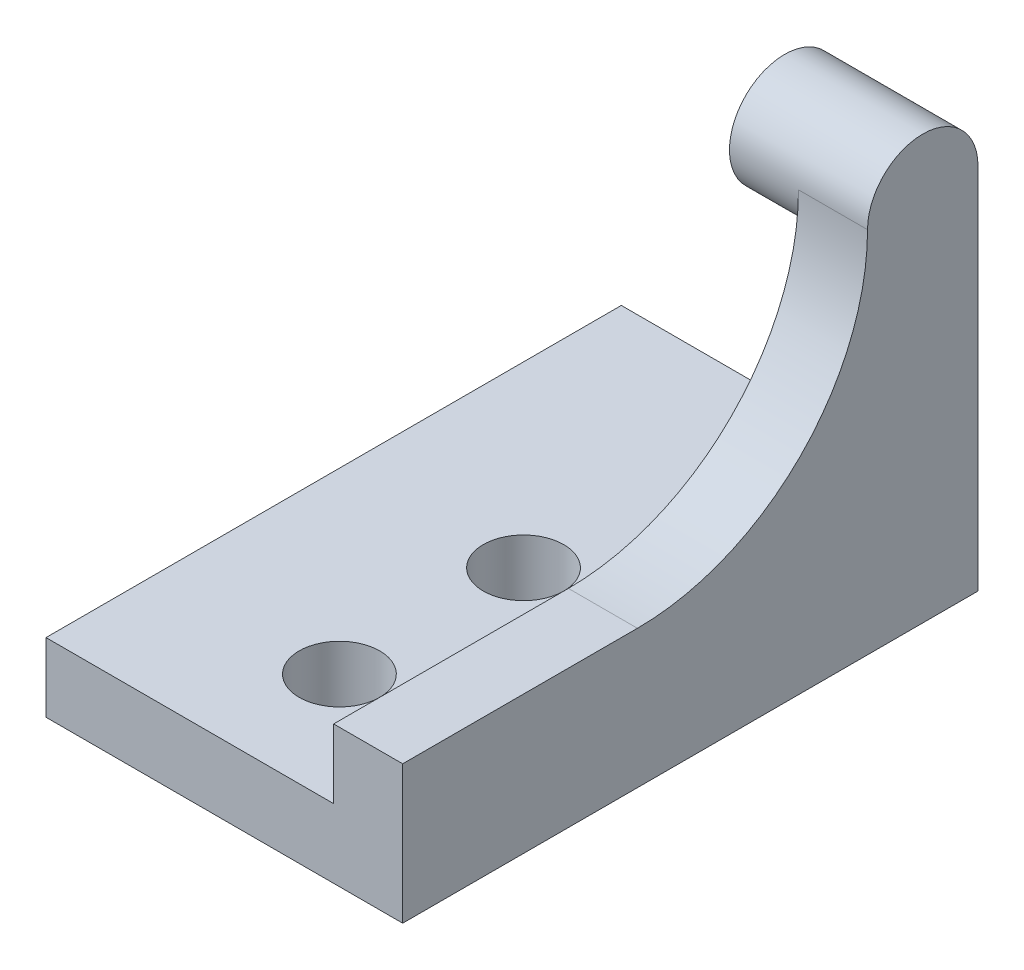
ISO-10303-21;
HEADER;
FILE_DESCRIPTION(('STEP AP214'),'2;1');
FILE_NAME('part.step','',(''),(''),'','','');
FILE_SCHEMA(('AUTOMOTIVE_DESIGN { 1 0 10303 214 1 1 1 1 }'));
ENDSEC;
DATA;
#1=APPLICATION_CONTEXT('core data for automotive mechanical design processes');
#2=APPLICATION_PROTOCOL_DEFINITION('international standard','automotive_design',2000,#1);
#3=PRODUCT_CONTEXT('',#1,'mechanical');
#4=PRODUCT('Part','Part','',(#3));
#5=PRODUCT_RELATED_PRODUCT_CATEGORY('part','',(#4));
#6=PRODUCT_DEFINITION_FORMATION('','',#4);
#7=PRODUCT_DEFINITION_CONTEXT('part definition',#1,'design');
#8=PRODUCT_DEFINITION('design','',#6,#7);
#9=PRODUCT_DEFINITION_SHAPE('','',#8);
#10=(LENGTH_UNIT() NAMED_UNIT(*) SI_UNIT(.MILLI.,.METRE.));
#11=(NAMED_UNIT(*) PLANE_ANGLE_UNIT() SI_UNIT($,.RADIAN.));
#12=(NAMED_UNIT(*) SI_UNIT($,.STERADIAN.) SOLID_ANGLE_UNIT());
#13=UNCERTAINTY_MEASURE_WITH_UNIT(LENGTH_MEASURE(1.E-05),#10,'distance_accuracy_value','');
#14=(GEOMETRIC_REPRESENTATION_CONTEXT(3) GLOBAL_UNCERTAINTY_ASSIGNED_CONTEXT((#13)) GLOBAL_UNIT_ASSIGNED_CONTEXT((#10,
#11,#12)) REPRESENTATION_CONTEXT('',''));
#15=CARTESIAN_POINT('',(0.,0.,0.));
#16=DIRECTION('',(0.,0.,1.));
#17=DIRECTION('',(1.,0.,0.));
#18=AXIS2_PLACEMENT_3D('',#15,#16,#17);
#19=CARTESIAN_POINT('',(3.,0.,0.));
#20=DIRECTION('',(-1.,0.,0.));
#21=DIRECTION('',(0.,0.,1.));
#22=AXIS2_PLACEMENT_3D('',#19,#20,#21);
#23=CYLINDRICAL_SURFACE('',#22,2.4);
#24=CARTESIAN_POINT('',(3.,0.,0.));
#25=DIRECTION('',(1.,0.,0.));
#26=DIRECTION('',(0.,0.,-1.));
#27=AXIS2_PLACEMENT_3D('',#24,#25,#26);
#28=CIRCLE('',#27,2.4);
#29=CARTESIAN_POINT('',(3.,0.,2.4));
#30=VERTEX_POINT('',#29);
#31=CARTESIAN_POINT('',(3.,0.,-2.4));
#32=VERTEX_POINT('',#31);
#33=EDGE_CURVE('E11',#30,#32,#28,.T.);
#34=ORIENTED_EDGE('',*,*,#33,.F.);
#35=DIRECTION('',(-1.,0.,0.));
#36=VECTOR('',#35,1.);
#37=CARTESIAN_POINT('',(6.,0.,2.4));
#38=LINE('',#37,#36);
#39=CARTESIAN_POINT('',(6.,0.,2.4));
#40=VERTEX_POINT('',#39);
#41=EDGE_CURVE('E157',#40,#30,#38,.T.);
#42=ORIENTED_EDGE('',*,*,#41,.F.);
#43=CARTESIAN_POINT('',(6.,0.,0.));
#44=DIRECTION('',(1.,0.,0.));
#45=DIRECTION('',(0.,0.,1.));
#46=AXIS2_PLACEMENT_3D('',#43,#44,#45);
#47=CIRCLE('',#46,2.4);
#48=CARTESIAN_POINT('',(6.,0.,-2.4));
#49=VERTEX_POINT('',#48);
#50=EDGE_CURVE('E59',#49,#40,#47,.T.);
#51=ORIENTED_EDGE('',*,*,#50,.F.);
#52=DIRECTION('',(-1.,0.,0.));
#53=VECTOR('',#52,1.);
#54=CARTESIAN_POINT('',(6.,0.,-2.4));
#55=LINE('',#54,#53);
#56=EDGE_CURVE('E169',#49,#32,#55,.T.);
#57=ORIENTED_EDGE('',*,*,#56,.T.);
#58=EDGE_LOOP('',(#34,#42,#51,#57));
#59=FACE_BOUND('',#58,.T.);
#60=CARTESIAN_POINT('',(0.,0.,0.));
#61=DIRECTION('',(1.,0.,0.));
#62=DIRECTION('',(0.,0.,-1.));
#63=AXIS2_PLACEMENT_3D('',#60,#61,#62);
#64=CIRCLE('',#63,2.4);
#65=CARTESIAN_POINT('',(0.,0.,-2.4));
#66=VERTEX_POINT('',#65);
#67=EDGE_CURVE('E41',#66,#66,#64,.T.);
#68=ORIENTED_EDGE('',*,*,#67,.T.);
#69=EDGE_LOOP('',(#68));
#70=FACE_BOUND('',#69,.T.);
#71=ADVANCED_FACE('F38',(#59,#70),#23,.T.);
#72=CARTESIAN_POINT('',(0.,0.,0.));
#73=DIRECTION('',(1.,0.,0.));
#74=DIRECTION('',(0.,0.,-1.));
#75=AXIS2_PLACEMENT_3D('',#72,#73,#74);
#76=PLANE('',#75);
#77=ORIENTED_EDGE('',*,*,#67,.F.);
#78=EDGE_LOOP('',(#77));
#79=FACE_BOUND('',#78,.T.);
#80=ADVANCED_FACE('F179',(#79),#76,.F.);
#81=CARTESIAN_POINT('',(6.,0.,12.4));
#82=DIRECTION('',(-1.,0.,0.));
#83=DIRECTION('',(0.,0.,1.));
#84=AXIS2_PLACEMENT_3D('',#81,#82,#83);
#85=CYLINDRICAL_SURFACE('',#84,10.);
#86=CARTESIAN_POINT('',(3.,0.,12.4));
#87=DIRECTION('',(-1.,0.,0.));
#88=DIRECTION('',(0.,0.,1.));
#89=AXIS2_PLACEMENT_3D('',#86,#87,#88);
#90=CIRCLE('',#89,10.);
#91=CARTESIAN_POINT('',(3.,-10.,12.4));
#92=VERTEX_POINT('',#91);
#93=EDGE_CURVE('E150',#30,#92,#90,.T.);
#94=ORIENTED_EDGE('',*,*,#93,.T.);
#95=DIRECTION('',(-1.,0.,0.));
#96=VECTOR('',#95,1.);
#97=CARTESIAN_POINT('',(6.,-10.,12.4));
#98=LINE('',#97,#96);
#99=CARTESIAN_POINT('',(6.,-10.,12.4));
#100=VERTEX_POINT('',#99);
#101=EDGE_CURVE('E173',#100,#92,#98,.T.);
#102=ORIENTED_EDGE('',*,*,#101,.F.);
#103=CARTESIAN_POINT('',(6.,0.,12.4));
#104=DIRECTION('',(-1.,0.,0.));
#105=DIRECTION('',(0.,0.,1.));
#106=AXIS2_PLACEMENT_3D('',#103,#104,#105);
#107=CIRCLE('',#106,10.);
#108=EDGE_CURVE('E151',#40,#100,#107,.T.);
#109=ORIENTED_EDGE('',*,*,#108,.F.);
#110=ORIENTED_EDGE('',*,*,#41,.T.);
#111=EDGE_LOOP('',(#94,#102,#109,#110));
#112=FACE_BOUND('',#111,.T.);
#113=ADVANCED_FACE('F181',(#112),#85,.F.);
#114=CARTESIAN_POINT('',(6.,-10.,22.6));
#115=DIRECTION('',(0.,-1.,0.));
#116=DIRECTION('',(0.,0.,-1.));
#117=AXIS2_PLACEMENT_3D('',#114,#115,#116);
#118=PLANE('',#117);
#119=DIRECTION('',(0.,0.,1.));
#120=VECTOR('',#119,1.);
#121=CARTESIAN_POINT('',(3.,-10.,22.6));
#122=LINE('',#121,#120);
#123=CARTESIAN_POINT('',(3.,-10.,22.6));
#124=VERTEX_POINT('',#123);
#125=EDGE_CURVE('E160',#92,#124,#122,.T.);
#126=ORIENTED_EDGE('',*,*,#125,.T.);
#127=DIRECTION('',(-1.,0.,0.));
#128=VECTOR('',#127,1.);
#129=CARTESIAN_POINT('',(6.,-10.,22.6));
#130=LINE('',#129,#128);
#131=CARTESIAN_POINT('',(6.,-10.,22.6));
#132=VERTEX_POINT('',#131);
#133=EDGE_CURVE('E171',#132,#124,#130,.T.);
#134=ORIENTED_EDGE('',*,*,#133,.F.);
#135=DIRECTION('',(0.,0.,1.));
#136=VECTOR('',#135,1.);
#137=CARTESIAN_POINT('',(6.,-10.,22.6));
#138=LINE('',#137,#136);
#139=EDGE_CURVE('E85',#100,#132,#138,.T.);
#140=ORIENTED_EDGE('',*,*,#139,.F.);
#141=ORIENTED_EDGE('',*,*,#101,.T.);
#142=EDGE_LOOP('',(#126,#134,#140,#141));
#143=FACE_BOUND('',#142,.T.);
#144=ADVANCED_FACE('F186',(#143),#118,.F.);
#145=CARTESIAN_POINT('',(6.,-13.,22.6));
#146=DIRECTION('',(0.,0.,-1.));
#147=DIRECTION('',(-1.,0.,0.));
#148=AXIS2_PLACEMENT_3D('',#145,#146,#147);
#149=PLANE('',#148);
#150=DIRECTION('',(0.,-1.,0.));
#151=VECTOR('',#150,1.);
#152=CARTESIAN_POINT('',(3.,-13.,22.6));
#153=LINE('',#152,#151);
#154=CARTESIAN_POINT('',(3.,-13.,22.6));
#155=VERTEX_POINT('',#154);
#156=EDGE_CURVE('E162',#124,#155,#153,.T.);
#157=ORIENTED_EDGE('',*,*,#156,.T.);
#158=DIRECTION('',(-1.,0.,0.));
#159=VECTOR('',#158,1.);
#160=CARTESIAN_POINT('',(6.,-13.,22.6));
#161=LINE('',#160,#159);
#162=CARTESIAN_POINT('',(-9.5,-13.,22.6));
#163=VERTEX_POINT('',#162);
#164=EDGE_CURVE('E143',#155,#163,#161,.T.);
#165=ORIENTED_EDGE('',*,*,#164,.T.);
#166=DIRECTION('',(0.,1.,0.));
#167=VECTOR('',#166,1.);
#168=CARTESIAN_POINT('',(-9.5,-16.,22.6));
#169=LINE('',#168,#167);
#170=CARTESIAN_POINT('',(-9.5,-16.,22.6));
#171=VERTEX_POINT('',#170);
#172=EDGE_CURVE('E121',#171,#163,#169,.T.);
#173=ORIENTED_EDGE('',*,*,#172,.F.);
#174=DIRECTION('',(-1.,0.,0.));
#175=VECTOR('',#174,1.);
#176=CARTESIAN_POINT('',(6.,-16.,22.6));
#177=LINE('',#176,#175);
#178=CARTESIAN_POINT('',(6.,-16.,22.6));
#179=VERTEX_POINT('',#178);
#180=EDGE_CURVE('E117',#179,#171,#177,.T.);
#181=ORIENTED_EDGE('',*,*,#180,.F.);
#182=DIRECTION('',(0.,-1.,0.));
#183=VECTOR('',#182,1.);
#184=CARTESIAN_POINT('',(6.,-13.,22.6));
#185=LINE('',#184,#183);
#186=EDGE_CURVE('E107',#132,#179,#185,.T.);
#187=ORIENTED_EDGE('',*,*,#186,.F.);
#188=ORIENTED_EDGE('',*,*,#133,.T.);
#189=EDGE_LOOP('',(#157,#165,#173,#181,#187,#188));
#190=FACE_BOUND('',#189,.T.);
#191=ADVANCED_FACE('F119',(#190),#149,.F.);
#192=CARTESIAN_POINT('',(6.,0.,-2.4));
#193=DIRECTION('',(0.,0.,1.));
#194=DIRECTION('',(0.,-1.,0.));
#195=AXIS2_PLACEMENT_3D('',#192,#193,#194);
#196=PLANE('',#195);
#197=DIRECTION('',(0.,1.,0.));
#198=VECTOR('',#197,1.);
#199=CARTESIAN_POINT('',(3.,0.,-2.4));
#200=LINE('',#199,#198);
#201=CARTESIAN_POINT('',(3.,-13.,-2.4));
#202=VERTEX_POINT('',#201);
#203=EDGE_CURVE('E153',#202,#32,#200,.T.);
#204=ORIENTED_EDGE('',*,*,#203,.T.);
#205=ORIENTED_EDGE('',*,*,#56,.F.);
#206=DIRECTION('',(0.,1.,0.));
#207=VECTOR('',#206,1.);
#208=CARTESIAN_POINT('',(6.,0.,-2.4));
#209=LINE('',#208,#207);
#210=CARTESIAN_POINT('',(6.,-16.,-2.4));
#211=VERTEX_POINT('',#210);
#212=EDGE_CURVE('E114',#211,#49,#209,.T.);
#213=ORIENTED_EDGE('',*,*,#212,.F.);
#214=DIRECTION('',(1.,0.,0.));
#215=VECTOR('',#214,1.);
#216=CARTESIAN_POINT('',(6.,-16.,-2.4));
#217=LINE('',#216,#215);
#218=CARTESIAN_POINT('',(-9.5,-16.,-2.4));
#219=VERTEX_POINT('',#218);
#220=EDGE_CURVE('E130',#219,#211,#217,.T.);
#221=ORIENTED_EDGE('',*,*,#220,.F.);
#222=DIRECTION('',(0.,1.,0.));
#223=VECTOR('',#222,1.);
#224=CARTESIAN_POINT('',(-9.5,-16.,-2.4));
#225=LINE('',#224,#223);
#226=CARTESIAN_POINT('',(-9.5,-13.,-2.4));
#227=VERTEX_POINT('',#226);
#228=EDGE_CURVE('E142',#219,#227,#225,.T.);
#229=ORIENTED_EDGE('',*,*,#228,.T.);
#230=DIRECTION('',(1.,0.,0.));
#231=VECTOR('',#230,1.);
#232=CARTESIAN_POINT('',(6.,-13.,-2.4));
#233=LINE('',#232,#231);
#234=EDGE_CURVE('E131',#227,#202,#233,.T.);
#235=ORIENTED_EDGE('',*,*,#234,.T.);
#236=EDGE_LOOP('',(#204,#205,#213,#221,#229,#235));
#237=FACE_BOUND('',#236,.T.);
#238=ADVANCED_FACE('F194',(#237),#196,.F.);
#239=CARTESIAN_POINT('',(6.,0.,12.4));
#240=DIRECTION('',(-1.,0.,0.));
#241=DIRECTION('',(0.,0.,1.));
#242=AXIS2_PLACEMENT_3D('',#239,#240,#241);
#243=PLANE('',#242);
#244=ORIENTED_EDGE('',*,*,#108,.T.);
#245=ORIENTED_EDGE('',*,*,#139,.T.);
#246=ORIENTED_EDGE('',*,*,#186,.T.);
#247=DIRECTION('',(0.,0.,1.));
#248=VECTOR('',#247,1.);
#249=CARTESIAN_POINT('',(6.,-16.,-2.4));
#250=LINE('',#249,#248);
#251=EDGE_CURVE('E111',#211,#179,#250,.T.);
#252=ORIENTED_EDGE('',*,*,#251,.F.);
#253=ORIENTED_EDGE('',*,*,#212,.T.);
#254=ORIENTED_EDGE('',*,*,#50,.T.);
#255=EDGE_LOOP('',(#244,#245,#246,#252,#253,#254));
#256=FACE_BOUND('',#255,.T.);
#257=ADVANCED_FACE('F109',(#256),#243,.F.);
#258=CARTESIAN_POINT('',(3.,0.,12.4));
#259=DIRECTION('',(-1.,0.,0.));
#260=DIRECTION('',(0.,0.,1.));
#261=AXIS2_PLACEMENT_3D('',#258,#259,#260);
#262=PLANE('',#261);
#263=ORIENTED_EDGE('',*,*,#93,.F.);
#264=ORIENTED_EDGE('',*,*,#33,.T.);
#265=ORIENTED_EDGE('',*,*,#203,.F.);
#266=DIRECTION('',(0.,0.,-1.));
#267=VECTOR('',#266,1.);
#268=CARTESIAN_POINT('',(3.,-13.,2.4));
#269=LINE('',#268,#267);
#270=EDGE_CURVE('E164',#155,#202,#269,.T.);
#271=ORIENTED_EDGE('',*,*,#270,.F.);
#272=ORIENTED_EDGE('',*,*,#156,.F.);
#273=ORIENTED_EDGE('',*,*,#125,.F.);
#274=EDGE_LOOP('',(#263,#264,#265,#271,#272,#273));
#275=FACE_BOUND('',#274,.T.);
#276=ADVANCED_FACE('F198',(#275),#262,.T.);
#277=CARTESIAN_POINT('',(0.,-13.,0.));
#278=DIRECTION('',(0.,-1.,0.));
#279=DIRECTION('',(0.,0.,-1.));
#280=AXIS2_PLACEMENT_3D('',#277,#278,#279);
#281=PLANE('',#280);
#282=CARTESIAN_POINT('',(-1.75,-13.,9.6));
#283=DIRECTION('',(0.,-1.,0.));
#284=DIRECTION('',(0.,0.,-1.));
#285=AXIS2_PLACEMENT_3D('',#282,#283,#284);
#286=CIRCLE('',#285,1.75);
#287=CARTESIAN_POINT('',(-1.75,-13.,7.85));
#288=VERTEX_POINT('',#287);
#289=EDGE_CURVE('E137',#288,#288,#286,.T.);
#290=ORIENTED_EDGE('',*,*,#289,.T.);
#291=EDGE_LOOP('',(#290));
#292=FACE_BOUND('',#291,.T.);
#293=CARTESIAN_POINT('',(-1.75,-13.,17.6));
#294=DIRECTION('',(0.,-1.,0.));
#295=DIRECTION('',(0.,0.,-1.));
#296=AXIS2_PLACEMENT_3D('',#293,#294,#295);
#297=CIRCLE('',#296,1.75);
#298=CARTESIAN_POINT('',(-1.75,-13.,15.85));
#299=VERTEX_POINT('',#298);
#300=EDGE_CURVE('E229',#299,#299,#297,.T.);
#301=ORIENTED_EDGE('',*,*,#300,.T.);
#302=EDGE_LOOP('',(#301));
#303=FACE_BOUND('',#302,.T.);
#304=ORIENTED_EDGE('',*,*,#164,.F.);
#305=ORIENTED_EDGE('',*,*,#270,.T.);
#306=ORIENTED_EDGE('',*,*,#234,.F.);
#307=DIRECTION('',(0.,0.,-1.));
#308=VECTOR('',#307,1.);
#309=CARTESIAN_POINT('',(-9.5,-13.,-2.4));
#310=LINE('',#309,#308);
#311=EDGE_CURVE('E134',#163,#227,#310,.T.);
#312=ORIENTED_EDGE('',*,*,#311,.F.);
#313=EDGE_LOOP('',(#304,#305,#306,#312));
#314=FACE_BOUND('',#313,.T.);
#315=ADVANCED_FACE('F201',(#292,#303,#314),#281,.F.);
#316=CARTESIAN_POINT('',(0.,-16.,0.));
#317=DIRECTION('',(0.,-1.,0.));
#318=DIRECTION('',(0.,0.,-1.));
#319=AXIS2_PLACEMENT_3D('',#316,#317,#318);
#320=PLANE('',#319);
#321=CARTESIAN_POINT('',(-1.75,-16.,9.6));
#322=DIRECTION('',(0.,-1.,0.));
#323=DIRECTION('',(0.,0.,-1.));
#324=AXIS2_PLACEMENT_3D('',#321,#322,#323);
#325=CIRCLE('',#324,1.75);
#326=CARTESIAN_POINT('',(-1.75,-16.,7.85));
#327=VERTEX_POINT('',#326);
#328=EDGE_CURVE('E145',#327,#327,#325,.T.);
#329=ORIENTED_EDGE('',*,*,#328,.F.);
#330=EDGE_LOOP('',(#329));
#331=FACE_BOUND('',#330,.T.);
#332=ORIENTED_EDGE('',*,*,#251,.T.);
#333=ORIENTED_EDGE('',*,*,#180,.T.);
#334=DIRECTION('',(0.,0.,-1.));
#335=VECTOR('',#334,1.);
#336=CARTESIAN_POINT('',(-9.5,-16.,-2.4));
#337=LINE('',#336,#335);
#338=EDGE_CURVE('E124',#171,#219,#337,.T.);
#339=ORIENTED_EDGE('',*,*,#338,.T.);
#340=ORIENTED_EDGE('',*,*,#220,.T.);
#341=EDGE_LOOP('',(#332,#333,#339,#340));
#342=FACE_BOUND('',#341,.T.);
#343=CARTESIAN_POINT('',(-1.75,-16.,17.6));
#344=DIRECTION('',(0.,-1.,0.));
#345=DIRECTION('',(0.,0.,-1.));
#346=AXIS2_PLACEMENT_3D('',#343,#344,#345);
#347=CIRCLE('',#346,1.75);
#348=CARTESIAN_POINT('',(-1.75,-16.,15.85));
#349=VERTEX_POINT('',#348);
#350=EDGE_CURVE('E226',#349,#349,#347,.T.);
#351=ORIENTED_EDGE('',*,*,#350,.F.);
#352=EDGE_LOOP('',(#351));
#353=FACE_BOUND('',#352,.T.);
#354=ADVANCED_FACE('F127',(#331,#342,#353),#320,.T.);
#355=CARTESIAN_POINT('',(-9.5,-16.,-2.4));
#356=DIRECTION('',(1.,0.,0.));
#357=DIRECTION('',(0.,0.,-1.));
#358=AXIS2_PLACEMENT_3D('',#355,#356,#357);
#359=PLANE('',#358);
#360=ORIENTED_EDGE('',*,*,#311,.T.);
#361=ORIENTED_EDGE('',*,*,#228,.F.);
#362=ORIENTED_EDGE('',*,*,#338,.F.);
#363=ORIENTED_EDGE('',*,*,#172,.T.);
#364=EDGE_LOOP('',(#360,#361,#362,#363));
#365=FACE_BOUND('',#364,.T.);
#366=ADVANCED_FACE('F204',(#365),#359,.F.);
#367=CARTESIAN_POINT('',(-1.75,-16.,9.6));
#368=DIRECTION('',(0.,1.,0.));
#369=DIRECTION('',(0.,0.,1.));
#370=AXIS2_PLACEMENT_3D('',#367,#368,#369);
#371=CYLINDRICAL_SURFACE('',#370,1.75);
#372=ORIENTED_EDGE('',*,*,#328,.T.);
#373=EDGE_LOOP('',(#372));
#374=FACE_BOUND('',#373,.T.);
#375=ORIENTED_EDGE('',*,*,#289,.F.);
#376=EDGE_LOOP('',(#375));
#377=FACE_BOUND('',#376,.T.);
#378=ADVANCED_FACE('F207',(#374,#377),#371,.F.);
#379=CARTESIAN_POINT('',(-1.75,-16.,17.6));
#380=DIRECTION('',(0.,1.,0.));
#381=DIRECTION('',(0.,0.,1.));
#382=AXIS2_PLACEMENT_3D('',#379,#380,#381);
#383=CYLINDRICAL_SURFACE('',#382,1.75);
#384=ORIENTED_EDGE('',*,*,#350,.T.);
#385=EDGE_LOOP('',(#384));
#386=FACE_BOUND('',#385,.T.);
#387=ORIENTED_EDGE('',*,*,#300,.F.);
#388=EDGE_LOOP('',(#387));
#389=FACE_BOUND('',#388,.T.);
#390=ADVANCED_FACE('F217',(#386,#389),#383,.F.);
#391=CLOSED_SHELL('',(#71,#80,#113,#144,#191,#238,#257,#276,#315,#354,#366,#378,#390));
#392=MANIFOLD_SOLID_BREP('B2',#391);
#393=ADVANCED_BREP_SHAPE_REPRESENTATION('',(#18,#392),#14);
#394=SHAPE_DEFINITION_REPRESENTATION(#9,#393);
ENDSEC;
END-ISO-10303-21;
